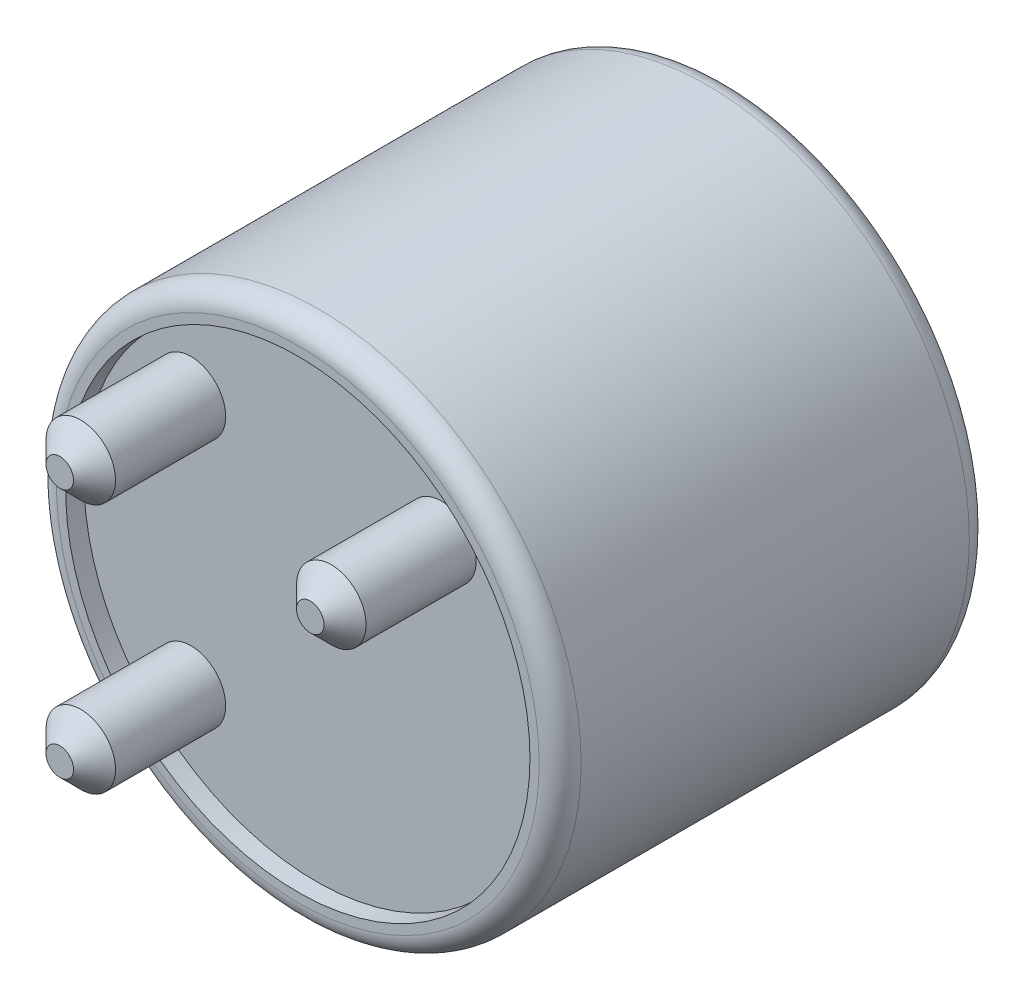
ISO-10303-21;
HEADER;
FILE_DESCRIPTION(('STEP AP214'),'2;1');
FILE_NAME('part.step','',(''),(''),'','','');
FILE_SCHEMA(('AUTOMOTIVE_DESIGN { 1 0 10303 214 1 1 1 1 }'));
ENDSEC;
DATA;
#1=APPLICATION_CONTEXT('core data for automotive mechanical design processes');
#2=APPLICATION_PROTOCOL_DEFINITION('international standard','automotive_design',2000,#1);
#3=PRODUCT_CONTEXT('',#1,'mechanical');
#4=PRODUCT('Part','Part','',(#3));
#5=PRODUCT_RELATED_PRODUCT_CATEGORY('part','',(#4));
#6=PRODUCT_DEFINITION_FORMATION('','',#4);
#7=PRODUCT_DEFINITION_CONTEXT('part definition',#1,'design');
#8=PRODUCT_DEFINITION('design','',#6,#7);
#9=PRODUCT_DEFINITION_SHAPE('','',#8);
#10=(LENGTH_UNIT() NAMED_UNIT(*) SI_UNIT(.MILLI.,.METRE.));
#11=(NAMED_UNIT(*) PLANE_ANGLE_UNIT() SI_UNIT($,.RADIAN.));
#12=(NAMED_UNIT(*) SI_UNIT($,.STERADIAN.) SOLID_ANGLE_UNIT());
#13=UNCERTAINTY_MEASURE_WITH_UNIT(LENGTH_MEASURE(1.E-05),#10,'distance_accuracy_value','');
#14=(GEOMETRIC_REPRESENTATION_CONTEXT(3) GLOBAL_UNCERTAINTY_ASSIGNED_CONTEXT((#13)) GLOBAL_UNIT_ASSIGNED_CONTEXT((#10,
#11,#12)) REPRESENTATION_CONTEXT('',''));
#15=CARTESIAN_POINT('',(0.,0.,0.));
#16=DIRECTION('',(0.,0.,1.));
#17=DIRECTION('',(1.,0.,0.));
#18=AXIS2_PLACEMENT_3D('',#15,#16,#17);
#19=CARTESIAN_POINT('',(0.,0.,16.4));
#20=DIRECTION('',(0.,0.,-1.));
#21=DIRECTION('',(-1.,0.,0.));
#22=AXIS2_PLACEMENT_3D('',#19,#20,#21);
#23=CYLINDRICAL_SURFACE('',#22,10.);
#24=CARTESIAN_POINT('',(0.,0.,0.8));
#25=DIRECTION('',(0.,0.,1.));
#26=DIRECTION('',(1.,0.,0.));
#27=AXIS2_PLACEMENT_3D('',#24,#25,#26);
#28=CIRCLE('',#27,10.);
#29=CARTESIAN_POINT('',(10.,0.,0.8));
#30=VERTEX_POINT('',#29);
#31=EDGE_CURVE('E58',#30,#30,#28,.T.);
#32=ORIENTED_EDGE('',*,*,#31,.T.);
#33=EDGE_LOOP('',(#32));
#34=FACE_BOUND('',#33,.T.);
#35=CARTESIAN_POINT('',(0.,0.,15.6));
#36=DIRECTION('',(0.,0.,1.));
#37=DIRECTION('',(1.,0.,0.));
#38=AXIS2_PLACEMENT_3D('',#35,#36,#37);
#39=CIRCLE('',#38,10.);
#40=CARTESIAN_POINT('',(10.,0.,15.6));
#41=VERTEX_POINT('',#40);
#42=EDGE_CURVE('E63',#41,#41,#39,.F.);
#43=ORIENTED_EDGE('',*,*,#42,.T.);
#44=EDGE_LOOP('',(#43));
#45=FACE_BOUND('',#44,.T.);
#46=ADVANCED_FACE('F45',(#34,#45),#23,.T.);
#47=CARTESIAN_POINT('',(0.,0.,16.4));
#48=DIRECTION('',(0.,0.,1.));
#49=DIRECTION('',(1.,0.,0.));
#50=AXIS2_PLACEMENT_3D('',#47,#48,#49);
#51=PLANE('',#50);
#52=CARTESIAN_POINT('',(0.,0.,16.4));
#53=DIRECTION('',(0.,0.,1.));
#54=DIRECTION('',(1.,0.,0.));
#55=AXIS2_PLACEMENT_3D('',#52,#53,#54);
#56=CIRCLE('',#55,9.2);
#57=CARTESIAN_POINT('',(9.2,0.,16.4));
#58=VERTEX_POINT('',#57);
#59=EDGE_CURVE('E10',#58,#58,#56,.T.);
#60=ORIENTED_EDGE('',*,*,#59,.T.);
#61=EDGE_LOOP('',(#60));
#62=FACE_BOUND('',#61,.T.);
#63=CARTESIAN_POINT('',(0.,0.,16.4));
#64=DIRECTION('',(0.,0.,1.));
#65=DIRECTION('',(1.,0.,0.));
#66=AXIS2_PLACEMENT_3D('',#63,#64,#65);
#67=CIRCLE('',#66,8.85);
#68=CARTESIAN_POINT('',(8.85,0.,16.4));
#69=VERTEX_POINT('',#68);
#70=EDGE_CURVE('E94',#69,#69,#67,.T.);
#71=ORIENTED_EDGE('',*,*,#70,.F.);
#72=EDGE_LOOP('',(#71));
#73=FACE_BOUND('',#72,.T.);
#74=ADVANCED_FACE('F155',(#62,#73),#51,.T.);
#75=CARTESIAN_POINT('',(0.,0.,0.));
#76=DIRECTION('',(0.,0.,1.));
#77=DIRECTION('',(1.,0.,0.));
#78=AXIS2_PLACEMENT_3D('',#75,#76,#77);
#79=PLANE('',#78);
#80=CARTESIAN_POINT('',(0.,0.,0.));
#81=DIRECTION('',(0.,0.,1.));
#82=DIRECTION('',(1.,0.,0.));
#83=AXIS2_PLACEMENT_3D('',#80,#81,#82);
#84=CIRCLE('',#83,9.2);
#85=CARTESIAN_POINT('',(9.2,0.,0.));
#86=VERTEX_POINT('',#85);
#87=EDGE_CURVE('E53',#86,#86,#84,.F.);
#88=ORIENTED_EDGE('',*,*,#87,.T.);
#89=EDGE_LOOP('',(#88));
#90=FACE_BOUND('',#89,.T.);
#91=CARTESIAN_POINT('',(0.,0.,0.));
#92=DIRECTION('',(0.,0.,-1.));
#93=DIRECTION('',(-1.,0.,0.));
#94=AXIS2_PLACEMENT_3D('',#91,#92,#93);
#95=CIRCLE('',#94,8.05);
#96=CARTESIAN_POINT('',(-8.05,0.,0.));
#97=VERTEX_POINT('',#96);
#98=EDGE_CURVE('E114',#97,#97,#95,.T.);
#99=ORIENTED_EDGE('',*,*,#98,.F.);
#100=EDGE_LOOP('',(#99));
#101=FACE_BOUND('',#100,.T.);
#102=ADVANCED_FACE('F152',(#90,#101),#79,.F.);
#103=CARTESIAN_POINT('',(0.,0.,15.7));
#104=DIRECTION('',(0.,0.,1.));
#105=DIRECTION('',(1.,0.,0.));
#106=AXIS2_PLACEMENT_3D('',#103,#104,#105);
#107=CYLINDRICAL_SURFACE('',#106,8.85);
#108=CARTESIAN_POINT('',(0.,0.,15.7));
#109=DIRECTION('',(0.,0.,1.));
#110=DIRECTION('',(1.,0.,0.));
#111=AXIS2_PLACEMENT_3D('',#108,#109,#110);
#112=CIRCLE('',#111,8.85);
#113=CARTESIAN_POINT('',(8.85,0.,15.7));
#114=VERTEX_POINT('',#113);
#115=EDGE_CURVE('E93',#114,#114,#112,.T.);
#116=ORIENTED_EDGE('',*,*,#115,.F.);
#117=EDGE_LOOP('',(#116));
#118=FACE_BOUND('',#117,.T.);
#119=ORIENTED_EDGE('',*,*,#70,.T.);
#120=EDGE_LOOP('',(#119));
#121=FACE_BOUND('',#120,.T.);
#122=ADVANCED_FACE('F154',(#118,#121),#107,.F.);
#123=CARTESIAN_POINT('',(0.,0.,15.7));
#124=DIRECTION('',(0.,0.,1.));
#125=DIRECTION('',(1.,0.,0.));
#126=AXIS2_PLACEMENT_3D('',#123,#124,#125);
#127=PLANE('',#126);
#128=CARTESIAN_POINT('',(4.775,4.775,15.7));
#129=DIRECTION('',(0.,0.,1.));
#130=DIRECTION('',(1.,0.,0.));
#131=AXIS2_PLACEMENT_3D('',#128,#129,#130);
#132=CIRCLE('',#131,1.325);
#133=CARTESIAN_POINT('',(6.1,4.775,15.7));
#134=VERTEX_POINT('',#133);
#135=EDGE_CURVE('E109',#134,#134,#132,.T.);
#136=ORIENTED_EDGE('',*,*,#135,.F.);
#137=EDGE_LOOP('',(#136));
#138=FACE_BOUND('',#137,.T.);
#139=CARTESIAN_POINT('',(-4.775,-4.775,15.7));
#140=DIRECTION('',(0.,0.,1.));
#141=DIRECTION('',(1.,0.,0.));
#142=AXIS2_PLACEMENT_3D('',#139,#140,#141);
#143=CIRCLE('',#142,1.325);
#144=CARTESIAN_POINT('',(-3.45,-4.775,15.7));
#145=VERTEX_POINT('',#144);
#146=EDGE_CURVE('E105',#145,#145,#143,.T.);
#147=ORIENTED_EDGE('',*,*,#146,.F.);
#148=EDGE_LOOP('',(#147));
#149=FACE_BOUND('',#148,.T.);
#150=CARTESIAN_POINT('',(-4.775,4.775,15.7));
#151=DIRECTION('',(0.,0.,1.));
#152=DIRECTION('',(1.,0.,0.));
#153=AXIS2_PLACEMENT_3D('',#150,#151,#152);
#154=CIRCLE('',#153,1.325);
#155=CARTESIAN_POINT('',(-3.45,4.775,15.7));
#156=VERTEX_POINT('',#155);
#157=EDGE_CURVE('E98',#156,#156,#154,.T.);
#158=ORIENTED_EDGE('',*,*,#157,.F.);
#159=EDGE_LOOP('',(#158));
#160=FACE_BOUND('',#159,.T.);
#161=ORIENTED_EDGE('',*,*,#115,.T.);
#162=EDGE_LOOP('',(#161));
#163=FACE_BOUND('',#162,.T.);
#164=ADVANCED_FACE('F162',(#138,#149,#160,#163),#127,.T.);
#165=CARTESIAN_POINT('',(-4.775,4.775,20.7));
#166=DIRECTION('',(0.,0.,-1.));
#167=DIRECTION('',(-1.,0.,0.));
#168=AXIS2_PLACEMENT_3D('',#165,#166,#167);
#169=CYLINDRICAL_SURFACE('',#168,1.325);
#170=CARTESIAN_POINT('',(-4.775,4.775,19.9));
#171=DIRECTION('',(0.,0.,1.));
#172=DIRECTION('',(1.,0.,0.));
#173=AXIS2_PLACEMENT_3D('',#170,#171,#172);
#174=CIRCLE('',#173,1.325);
#175=CARTESIAN_POINT('',(-3.45,4.775,19.9));
#176=VERTEX_POINT('',#175);
#177=EDGE_CURVE('E69',#176,#176,#174,.F.);
#178=ORIENTED_EDGE('',*,*,#177,.T.);
#179=EDGE_LOOP('',(#178));
#180=FACE_BOUND('',#179,.T.);
#181=ORIENTED_EDGE('',*,*,#157,.T.);
#182=EDGE_LOOP('',(#181));
#183=FACE_BOUND('',#182,.T.);
#184=ADVANCED_FACE('F293',(#180,#183),#169,.T.);
#185=CARTESIAN_POINT('',(-4.775,4.775,20.7));
#186=DIRECTION('',(0.,0.,1.));
#187=DIRECTION('',(1.,0.,0.));
#188=AXIS2_PLACEMENT_3D('',#185,#186,#187);
#189=PLANE('',#188);
#190=CARTESIAN_POINT('',(-4.775,4.775,20.7));
#191=DIRECTION('',(0.,0.,1.));
#192=DIRECTION('',(1.,0.,0.));
#193=AXIS2_PLACEMENT_3D('',#190,#191,#192);
#194=CIRCLE('',#193,0.525000000000001);
#195=CARTESIAN_POINT('',(-4.25,4.775,20.7));
#196=VERTEX_POINT('',#195);
#197=EDGE_CURVE('E73',#196,#196,#194,.T.);
#198=ORIENTED_EDGE('',*,*,#197,.T.);
#199=EDGE_LOOP('',(#198));
#200=FACE_BOUND('',#199,.T.);
#201=ADVANCED_FACE('F284',(#200),#189,.T.);
#202=CARTESIAN_POINT('',(-4.775,-4.775,20.7));
#203=DIRECTION('',(0.,0.,-1.));
#204=DIRECTION('',(-1.,0.,0.));
#205=AXIS2_PLACEMENT_3D('',#202,#203,#204);
#206=CYLINDRICAL_SURFACE('',#205,1.325);
#207=CARTESIAN_POINT('',(-4.775,-4.775,19.9));
#208=DIRECTION('',(0.,0.,1.));
#209=DIRECTION('',(1.,0.,0.));
#210=AXIS2_PLACEMENT_3D('',#207,#208,#209);
#211=CIRCLE('',#210,1.325);
#212=CARTESIAN_POINT('',(-3.45,-4.775,19.9));
#213=VERTEX_POINT('',#212);
#214=EDGE_CURVE('E77',#213,#213,#211,.F.);
#215=ORIENTED_EDGE('',*,*,#214,.T.);
#216=EDGE_LOOP('',(#215));
#217=FACE_BOUND('',#216,.T.);
#218=ORIENTED_EDGE('',*,*,#146,.T.);
#219=EDGE_LOOP('',(#218));
#220=FACE_BOUND('',#219,.T.);
#221=ADVANCED_FACE('F275',(#217,#220),#206,.T.);
#222=CARTESIAN_POINT('',(-4.775,-4.775,20.7));
#223=DIRECTION('',(0.,0.,1.));
#224=DIRECTION('',(1.,0.,0.));
#225=AXIS2_PLACEMENT_3D('',#222,#223,#224);
#226=PLANE('',#225);
#227=CARTESIAN_POINT('',(-4.775,-4.775,20.7));
#228=DIRECTION('',(0.,0.,1.));
#229=DIRECTION('',(1.,0.,0.));
#230=AXIS2_PLACEMENT_3D('',#227,#228,#229);
#231=CIRCLE('',#230,0.525000000000001);
#232=CARTESIAN_POINT('',(-4.25,-4.775,20.7));
#233=VERTEX_POINT('',#232);
#234=EDGE_CURVE('E81',#233,#233,#231,.T.);
#235=ORIENTED_EDGE('',*,*,#234,.T.);
#236=EDGE_LOOP('',(#235));
#237=FACE_BOUND('',#236,.T.);
#238=ADVANCED_FACE('F266',(#237),#226,.T.);
#239=CARTESIAN_POINT('',(4.775,4.775,20.7));
#240=DIRECTION('',(0.,0.,-1.));
#241=DIRECTION('',(-1.,0.,0.));
#242=AXIS2_PLACEMENT_3D('',#239,#240,#241);
#243=CYLINDRICAL_SURFACE('',#242,1.325);
#244=CARTESIAN_POINT('',(4.775,4.775,19.9));
#245=DIRECTION('',(0.,0.,1.));
#246=DIRECTION('',(1.,0.,0.));
#247=AXIS2_PLACEMENT_3D('',#244,#245,#246);
#248=CIRCLE('',#247,1.325);
#249=CARTESIAN_POINT('',(6.1,4.775,19.9));
#250=VERTEX_POINT('',#249);
#251=EDGE_CURVE('E85',#250,#250,#248,.F.);
#252=ORIENTED_EDGE('',*,*,#251,.T.);
#253=EDGE_LOOP('',(#252));
#254=FACE_BOUND('',#253,.T.);
#255=ORIENTED_EDGE('',*,*,#135,.T.);
#256=EDGE_LOOP('',(#255));
#257=FACE_BOUND('',#256,.T.);
#258=ADVANCED_FACE('F257',(#254,#257),#243,.T.);
#259=CARTESIAN_POINT('',(4.775,4.775,20.7));
#260=DIRECTION('',(0.,0.,1.));
#261=DIRECTION('',(1.,0.,0.));
#262=AXIS2_PLACEMENT_3D('',#259,#260,#261);
#263=PLANE('',#262);
#264=CARTESIAN_POINT('',(4.775,4.775,20.7));
#265=DIRECTION('',(0.,0.,1.));
#266=DIRECTION('',(1.,0.,0.));
#267=AXIS2_PLACEMENT_3D('',#264,#265,#266);
#268=CIRCLE('',#267,0.525000000000001);
#269=CARTESIAN_POINT('',(5.3,4.775,20.7));
#270=VERTEX_POINT('',#269);
#271=EDGE_CURVE('E89',#270,#270,#268,.T.);
#272=ORIENTED_EDGE('',*,*,#271,.T.);
#273=EDGE_LOOP('',(#272));
#274=FACE_BOUND('',#273,.T.);
#275=ADVANCED_FACE('F181',(#274),#263,.T.);
#276=CARTESIAN_POINT('',(4.775,4.775,20.7));
#277=DIRECTION('',(0.,0.,-1.));
#278=DIRECTION('',(-1.,0.,0.));
#279=AXIS2_PLACEMENT_3D('',#276,#277,#278);
#280=CONICAL_SURFACE('',#279,0.525000000000001,0.785398163397446);
#281=ORIENTED_EDGE('',*,*,#251,.F.);
#282=EDGE_LOOP('',(#281));
#283=FACE_BOUND('',#282,.T.);
#284=ORIENTED_EDGE('',*,*,#271,.F.);
#285=EDGE_LOOP('',(#284));
#286=FACE_BOUND('',#285,.T.);
#287=ADVANCED_FACE('F174',(#283,#286),#280,.T.);
#288=CARTESIAN_POINT('',(-4.775,-4.775,20.7));
#289=DIRECTION('',(0.,0.,-1.));
#290=DIRECTION('',(-1.,0.,0.));
#291=AXIS2_PLACEMENT_3D('',#288,#289,#290);
#292=CONICAL_SURFACE('',#291,0.525000000000001,0.785398163397446);
#293=ORIENTED_EDGE('',*,*,#214,.F.);
#294=EDGE_LOOP('',(#293));
#295=FACE_BOUND('',#294,.T.);
#296=ORIENTED_EDGE('',*,*,#234,.F.);
#297=EDGE_LOOP('',(#296));
#298=FACE_BOUND('',#297,.T.);
#299=ADVANCED_FACE('F180',(#295,#298),#292,.T.);
#300=CARTESIAN_POINT('',(-4.775,4.775,20.7));
#301=DIRECTION('',(0.,0.,-1.));
#302=DIRECTION('',(-1.,0.,0.));
#303=AXIS2_PLACEMENT_3D('',#300,#301,#302);
#304=CONICAL_SURFACE('',#303,0.525000000000001,0.785398163397446);
#305=ORIENTED_EDGE('',*,*,#177,.F.);
#306=EDGE_LOOP('',(#305));
#307=FACE_BOUND('',#306,.T.);
#308=ORIENTED_EDGE('',*,*,#197,.F.);
#309=EDGE_LOOP('',(#308));
#310=FACE_BOUND('',#309,.T.);
#311=ADVANCED_FACE('F148',(#307,#310),#304,.T.);
#312=CARTESIAN_POINT('',(0.,0.,0.4));
#313=DIRECTION('',(0.,0.,-1.));
#314=DIRECTION('',(-1.,0.,0.));
#315=AXIS2_PLACEMENT_3D('',#312,#313,#314);
#316=CYLINDRICAL_SURFACE('',#315,8.05);
#317=CARTESIAN_POINT('',(0.,0.,0.4));
#318=DIRECTION('',(0.,0.,-1.));
#319=DIRECTION('',(-1.,0.,0.));
#320=AXIS2_PLACEMENT_3D('',#317,#318,#319);
#321=CIRCLE('',#320,8.05);
#322=CARTESIAN_POINT('',(-8.05,0.,0.4));
#323=VERTEX_POINT('',#322);
#324=EDGE_CURVE('E113',#323,#323,#321,.T.);
#325=ORIENTED_EDGE('',*,*,#324,.F.);
#326=EDGE_LOOP('',(#325));
#327=FACE_BOUND('',#326,.T.);
#328=ORIENTED_EDGE('',*,*,#98,.T.);
#329=EDGE_LOOP('',(#328));
#330=FACE_BOUND('',#329,.T.);
#331=ADVANCED_FACE('F142',(#327,#330),#316,.F.);
#332=CARTESIAN_POINT('',(0.,0.,0.4));
#333=DIRECTION('',(0.,0.,-1.));
#334=DIRECTION('',(-1.,0.,0.));
#335=AXIS2_PLACEMENT_3D('',#332,#333,#334);
#336=PLANE('',#335);
#337=CARTESIAN_POINT('',(0.,0.,0.4));
#338=DIRECTION('',(0.,0.,-1.));
#339=DIRECTION('',(-1.,0.,0.));
#340=AXIS2_PLACEMENT_3D('',#337,#338,#339);
#341=CIRCLE('',#340,7.);
#342=CARTESIAN_POINT('',(-7.,0.,0.4));
#343=VERTEX_POINT('',#342);
#344=EDGE_CURVE('E122',#343,#343,#341,.T.);
#345=ORIENTED_EDGE('',*,*,#344,.F.);
#346=EDGE_LOOP('',(#345));
#347=FACE_BOUND('',#346,.T.);
#348=ORIENTED_EDGE('',*,*,#324,.T.);
#349=EDGE_LOOP('',(#348));
#350=FACE_BOUND('',#349,.T.);
#351=ADVANCED_FACE('F138',(#347,#350),#336,.T.);
#352=CARTESIAN_POINT('',(0.,0.,0.8));
#353=DIRECTION('',(0.,0.,1.));
#354=DIRECTION('',(1.,0.,0.));
#355=AXIS2_PLACEMENT_3D('',#352,#353,#354);
#356=TOROIDAL_SURFACE('',#355,9.2,0.8);
#357=ORIENTED_EDGE('',*,*,#87,.F.);
#358=EDGE_LOOP('',(#357));
#359=FACE_BOUND('',#358,.T.);
#360=ORIENTED_EDGE('',*,*,#31,.F.);
#361=EDGE_LOOP('',(#360));
#362=FACE_BOUND('',#361,.T.);
#363=ADVANCED_FACE('F141',(#359,#362),#356,.T.);
#364=CARTESIAN_POINT('',(0.,0.,15.6));
#365=DIRECTION('',(0.,0.,1.));
#366=DIRECTION('',(1.,0.,0.));
#367=AXIS2_PLACEMENT_3D('',#364,#365,#366);
#368=TOROIDAL_SURFACE('',#367,9.2,0.8);
#369=ORIENTED_EDGE('',*,*,#42,.F.);
#370=EDGE_LOOP('',(#369));
#371=FACE_BOUND('',#370,.T.);
#372=ORIENTED_EDGE('',*,*,#59,.F.);
#373=EDGE_LOOP('',(#372));
#374=FACE_BOUND('',#373,.T.);
#375=ADVANCED_FACE('F47',(#371,#374),#368,.T.);
#376=CARTESIAN_POINT('',(0.,0.,0.2));
#377=DIRECTION('',(0.,0.,1.));
#378=DIRECTION('',(1.,0.,0.));
#379=AXIS2_PLACEMENT_3D('',#376,#377,#378);
#380=CYLINDRICAL_SURFACE('',#379,7.);
#381=CARTESIAN_POINT('',(0.,0.,0.2));
#382=DIRECTION('',(0.,0.,-1.));
#383=DIRECTION('',(-1.,0.,0.));
#384=AXIS2_PLACEMENT_3D('',#381,#382,#383);
#385=CIRCLE('',#384,7.);
#386=CARTESIAN_POINT('',(-7.,0.,0.2));
#387=VERTEX_POINT('',#386);
#388=EDGE_CURVE('E118',#387,#387,#385,.T.);
#389=ORIENTED_EDGE('',*,*,#388,.F.);
#390=EDGE_LOOP('',(#389));
#391=FACE_BOUND('',#390,.T.);
#392=ORIENTED_EDGE('',*,*,#344,.T.);
#393=EDGE_LOOP('',(#392));
#394=FACE_BOUND('',#393,.T.);
#395=ADVANCED_FACE('F132',(#391,#394),#380,.T.);
#396=CARTESIAN_POINT('',(0.,0.,0.2));
#397=DIRECTION('',(0.,0.,-1.));
#398=DIRECTION('',(-1.,0.,0.));
#399=AXIS2_PLACEMENT_3D('',#396,#397,#398);
#400=PLANE('',#399);
#401=ORIENTED_EDGE('',*,*,#388,.T.);
#402=EDGE_LOOP('',(#401));
#403=FACE_BOUND('',#402,.T.);
#404=ADVANCED_FACE('F130',(#403),#400,.T.);
#405=CLOSED_SHELL('',(#46,#74,#102,#122,#164,#184,#201,#221,#238,#258,#275,#287,#299,#311,#331,
#351,#363,#375,#395,#404));
#406=MANIFOLD_SOLID_BREP('B2',#405);
#407=ADVANCED_BREP_SHAPE_REPRESENTATION('',(#18,#406),#14);
#408=SHAPE_DEFINITION_REPRESENTATION(#9,#407);
ENDSEC;
END-ISO-10303-21;
